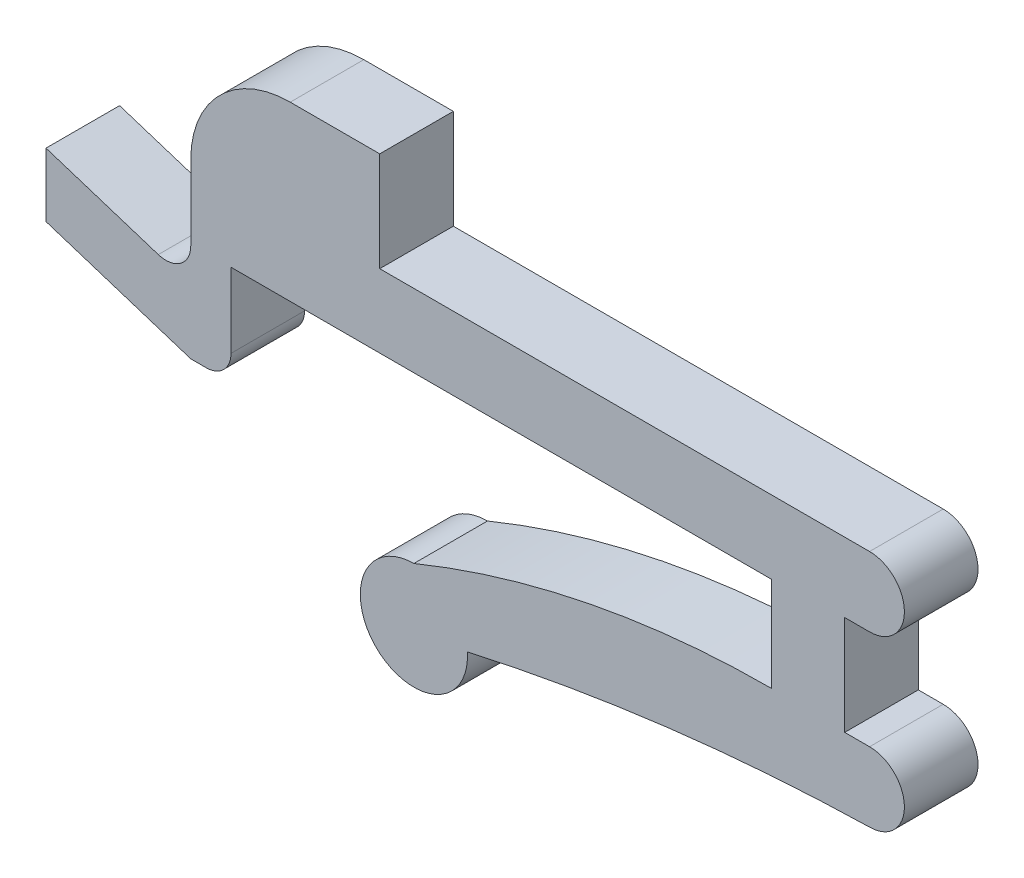
ISO-10303-21;
HEADER;
FILE_DESCRIPTION(('STEP AP214'),'2;1');
FILE_NAME('part.step','',(''),(''),'','','');
FILE_SCHEMA(('AUTOMOTIVE_DESIGN { 1 0 10303 214 1 1 1 1 }'));
ENDSEC;
DATA;
#1=APPLICATION_CONTEXT('core data for automotive mechanical design processes');
#2=APPLICATION_PROTOCOL_DEFINITION('international standard','automotive_design',2000,#1);
#3=PRODUCT_CONTEXT('',#1,'mechanical');
#4=PRODUCT('Part','Part','',(#3));
#5=PRODUCT_RELATED_PRODUCT_CATEGORY('part','',(#4));
#6=PRODUCT_DEFINITION_FORMATION('','',#4);
#7=PRODUCT_DEFINITION_CONTEXT('part definition',#1,'design');
#8=PRODUCT_DEFINITION('design','',#6,#7);
#9=PRODUCT_DEFINITION_SHAPE('','',#8);
#10=(LENGTH_UNIT() NAMED_UNIT(*) SI_UNIT(.MILLI.,.METRE.));
#11=(NAMED_UNIT(*) PLANE_ANGLE_UNIT() SI_UNIT($,.RADIAN.));
#12=(NAMED_UNIT(*) SI_UNIT($,.STERADIAN.) SOLID_ANGLE_UNIT());
#13=UNCERTAINTY_MEASURE_WITH_UNIT(LENGTH_MEASURE(1.E-05),#10,'distance_accuracy_value','');
#14=(GEOMETRIC_REPRESENTATION_CONTEXT(3) GLOBAL_UNCERTAINTY_ASSIGNED_CONTEXT((#13)) GLOBAL_UNIT_ASSIGNED_CONTEXT((#10,
#11,#12)) REPRESENTATION_CONTEXT('',''));
#15=CARTESIAN_POINT('',(0.,0.,0.));
#16=DIRECTION('',(0.,0.,1.));
#17=DIRECTION('',(1.,0.,0.));
#18=AXIS2_PLACEMENT_3D('',#15,#16,#17);
#19=CARTESIAN_POINT('',(62.8560596556779,59.3978768066607,19.7358));
#20=DIRECTION('',(-1.,0.,0.));
#21=DIRECTION('',(0.,0.,1.));
#22=AXIS2_PLACEMENT_3D('',#19,#20,#21);
#23=PLANE('',#22);
#24=DIRECTION('',(0.,1.,0.));
#25=VECTOR('',#24,1.);
#26=CARTESIAN_POINT('',(62.8560596556779,59.3978768066607,17.8562));
#27=LINE('',#26,#25);
#28=CARTESIAN_POINT('',(62.8560596556779,59.3978768066607,17.8562));
#29=VERTEX_POINT('',#28);
#30=CARTESIAN_POINT('',(62.8560596556779,61.9378768066607,17.8562));
#31=VERTEX_POINT('',#30);
#32=EDGE_CURVE('E206',#29,#31,#27,.T.);
#33=ORIENTED_EDGE('',*,*,#32,.T.);
#34=DIRECTION('',(0.,0.,-1.));
#35=VECTOR('',#34,1.);
#36=CARTESIAN_POINT('',(62.8560596556779,61.9378768066607,19.7358));
#37=LINE('',#36,#35);
#38=CARTESIAN_POINT('',(62.8560596556779,61.9378768066607,19.7358));
#39=VERTEX_POINT('',#38);
#40=EDGE_CURVE('E188',#39,#31,#37,.T.);
#41=ORIENTED_EDGE('',*,*,#40,.F.);
#42=DIRECTION('',(0.,1.,0.));
#43=VECTOR('',#42,1.);
#44=CARTESIAN_POINT('',(62.8560596556779,59.3978768066607,19.7358));
#45=LINE('',#44,#43);
#46=CARTESIAN_POINT('',(62.8560596556779,59.3978768066607,19.7358));
#47=VERTEX_POINT('',#46);
#48=EDGE_CURVE('E195',#47,#39,#45,.T.);
#49=ORIENTED_EDGE('',*,*,#48,.F.);
#50=DIRECTION('',(0.,0.,-1.));
#51=VECTOR('',#50,1.);
#52=CARTESIAN_POINT('',(62.8560596556779,59.3978768066607,19.7358));
#53=LINE('',#52,#51);
#54=EDGE_CURVE('E291',#47,#29,#53,.T.);
#55=ORIENTED_EDGE('',*,*,#54,.T.);
#56=EDGE_LOOP('',(#33,#41,#49,#55));
#57=FACE_BOUND('',#56,.T.);
#58=ADVANCED_FACE('F34',(#57),#23,.F.);
#59=CARTESIAN_POINT('',(62.8560596556779,61.9378768066607,19.7358));
#60=DIRECTION('',(0.,-1.,0.));
#61=DIRECTION('',(0.,0.,-1.));
#62=AXIS2_PLACEMENT_3D('',#59,#60,#61);
#63=PLANE('',#62);
#64=DIRECTION('',(-1.,0.,0.));
#65=VECTOR('',#64,1.);
#66=CARTESIAN_POINT('',(62.8560596556779,61.9378768066607,17.8562));
#67=LINE('',#66,#65);
#68=CARTESIAN_POINT('',(60.5700596556779,61.9378768066607,17.8562));
#69=VERTEX_POINT('',#68);
#70=EDGE_CURVE('E251',#31,#69,#67,.T.);
#71=ORIENTED_EDGE('',*,*,#70,.T.);
#72=DIRECTION('',(0.,0.,-1.));
#73=VECTOR('',#72,1.);
#74=CARTESIAN_POINT('',(60.5700596556779,61.9378768066607,19.7358));
#75=LINE('',#74,#73);
#76=CARTESIAN_POINT('',(60.5700596556779,61.9378768066607,19.7358));
#77=VERTEX_POINT('',#76);
#78=EDGE_CURVE('E191',#69,#77,#75,.F.);
#79=ORIENTED_EDGE('',*,*,#78,.T.);
#80=DIRECTION('',(-1.,0.,0.));
#81=VECTOR('',#80,1.);
#82=CARTESIAN_POINT('',(62.8560596556779,61.9378768066607,19.7358));
#83=LINE('',#82,#81);
#84=EDGE_CURVE('E183',#39,#77,#83,.T.);
#85=ORIENTED_EDGE('',*,*,#84,.F.);
#86=ORIENTED_EDGE('',*,*,#40,.T.);
#87=EDGE_LOOP('',(#71,#79,#85,#86));
#88=FACE_BOUND('',#87,.T.);
#89=ADVANCED_FACE('F186',(#88),#63,.F.);
#90=CARTESIAN_POINT('',(58.0300596556779,60.9219383389659,19.7358));
#91=DIRECTION('',(1.,0.,0.));
#92=DIRECTION('',(0.,1.,0.));
#93=AXIS2_PLACEMENT_3D('',#90,#91,#92);
#94=PLANE('',#93);
#95=DIRECTION('',(0.,-1.,0.));
#96=VECTOR('',#95,1.);
#97=CARTESIAN_POINT('',(58.0300596556779,60.9219383389659,17.8562));
#98=LINE('',#97,#96);
#99=CARTESIAN_POINT('',(58.0300596556779,59.3978768066607,17.8562));
#100=VERTEX_POINT('',#99);
#101=CARTESIAN_POINT('',(58.0300596556779,57.48726548621,17.8562));
#102=VERTEX_POINT('',#101);
#103=EDGE_CURVE('E247',#100,#102,#98,.T.);
#104=ORIENTED_EDGE('',*,*,#103,.T.);
#105=DIRECTION('',(0.,0.,-1.));
#106=VECTOR('',#105,1.);
#107=CARTESIAN_POINT('',(58.0300596556779,57.48726548621,19.7358));
#108=LINE('',#107,#106);
#109=CARTESIAN_POINT('',(58.0300596556779,57.48726548621,19.7358));
#110=VERTEX_POINT('',#109);
#111=EDGE_CURVE('E55',#102,#110,#108,.F.);
#112=ORIENTED_EDGE('',*,*,#111,.T.);
#113=DIRECTION('',(0.,-1.,0.));
#114=VECTOR('',#113,1.);
#115=CARTESIAN_POINT('',(58.0300596556779,61.9378768066607,19.7358));
#116=LINE('',#115,#114);
#117=CARTESIAN_POINT('',(58.0300596556779,59.3978768066607,19.7358));
#118=VERTEX_POINT('',#117);
#119=EDGE_CURVE('E194',#118,#110,#116,.T.);
#120=ORIENTED_EDGE('',*,*,#119,.F.);
#121=DIRECTION('',(0.,0.,-1.));
#122=VECTOR('',#121,1.);
#123=CARTESIAN_POINT('',(58.0300596556779,59.3978768066607,19.7358));
#124=LINE('',#123,#122);
#125=EDGE_CURVE('E223',#118,#100,#124,.T.);
#126=ORIENTED_EDGE('',*,*,#125,.T.);
#127=EDGE_LOOP('',(#104,#112,#120,#126));
#128=FACE_BOUND('',#127,.T.);
#129=ADVANCED_FACE('F374',(#128),#94,.F.);
#130=CARTESIAN_POINT('',(58.0300596556779,56.6165768066607,19.7358));
#131=DIRECTION('',(-0.30557694918218,-0.952167384512047,0.));
#132=DIRECTION('',(0.952167384512047,-0.30557694918218,0.));
#133=AXIS2_PLACEMENT_3D('',#130,#131,#132);
#134=PLANE('',#133);
#135=DIRECTION('',(-0.952167384512047,0.30557694918218,0.));
#136=VECTOR('',#135,1.);
#137=CARTESIAN_POINT('',(58.0300596556779,56.6165768066607,19.7358));
#138=LINE('',#137,#136);
#139=CARTESIAN_POINT('',(57.2010182929472,56.8826391970449,19.7358));
#140=VERTEX_POINT('',#139);
#141=CARTESIAN_POINT('',(54.3331990812724,57.8030020027492,19.7358));
#142=VERTEX_POINT('',#141);
#143=EDGE_CURVE('E240',#140,#142,#138,.T.);
#144=ORIENTED_EDGE('',*,*,#143,.F.);
#145=DIRECTION('',(0.,0.,-1.));
#146=VECTOR('',#145,1.);
#147=CARTESIAN_POINT('',(57.2010182929472,56.8826391970449,17.8562));
#148=LINE('',#147,#146);
#149=CARTESIAN_POINT('',(57.2010182929472,56.8826391970449,17.8562));
#150=VERTEX_POINT('',#149);
#151=EDGE_CURVE('E231',#140,#150,#148,.T.);
#152=ORIENTED_EDGE('',*,*,#151,.T.);
#153=DIRECTION('',(-0.952167384512047,0.30557694918218,0.));
#154=VECTOR('',#153,1.);
#155=CARTESIAN_POINT('',(58.0300596556779,56.6165768066607,17.8562));
#156=LINE('',#155,#154);
#157=CARTESIAN_POINT('',(54.3331990812724,57.8030020027492,17.8562));
#158=VERTEX_POINT('',#157);
#159=EDGE_CURVE('E239',#150,#158,#156,.T.);
#160=ORIENTED_EDGE('',*,*,#159,.T.);
#161=DIRECTION('',(0.,0.,-1.));
#162=VECTOR('',#161,1.);
#163=CARTESIAN_POINT('',(54.3331990812724,57.8030020027492,19.7358));
#164=LINE('',#163,#162);
#165=EDGE_CURVE('E208',#142,#158,#164,.T.);
#166=ORIENTED_EDGE('',*,*,#165,.F.);
#167=EDGE_LOOP('',(#144,#152,#160,#166));
#168=FACE_BOUND('',#167,.T.);
#169=ADVANCED_FACE('F237',(#168),#134,.F.);
#170=CARTESIAN_POINT('',(54.3331990812724,57.8030020027492,19.7358));
#171=DIRECTION('',(1.,0.,0.));
#172=DIRECTION('',(0.,0.,-1.));
#173=AXIS2_PLACEMENT_3D('',#170,#171,#172);
#174=PLANE('',#173);
#175=DIRECTION('',(0.,-1.,0.));
#176=VECTOR('',#175,1.);
#177=CARTESIAN_POINT('',(54.3331990812724,57.8030020027492,17.8562));
#178=LINE('',#177,#176);
#179=CARTESIAN_POINT('',(54.3331990812724,56.1774020027492,17.8562));
#180=VERTEX_POINT('',#179);
#181=EDGE_CURVE('E246',#158,#180,#178,.T.);
#182=ORIENTED_EDGE('',*,*,#181,.T.);
#183=DIRECTION('',(0.,0.,-1.));
#184=VECTOR('',#183,1.);
#185=CARTESIAN_POINT('',(54.3331990812724,56.1774020027492,19.7358));
#186=LINE('',#185,#184);
#187=CARTESIAN_POINT('',(54.3331990812724,56.1774020027492,19.7358));
#188=VERTEX_POINT('',#187);
#189=EDGE_CURVE('E214',#188,#180,#186,.T.);
#190=ORIENTED_EDGE('',*,*,#189,.F.);
#191=DIRECTION('',(0.,-1.,0.));
#192=VECTOR('',#191,1.);
#193=CARTESIAN_POINT('',(54.3331990812724,57.8030020027492,19.7358));
#194=LINE('',#193,#192);
#195=EDGE_CURVE('E339',#142,#188,#194,.T.);
#196=ORIENTED_EDGE('',*,*,#195,.F.);
#197=ORIENTED_EDGE('',*,*,#165,.T.);
#198=EDGE_LOOP('',(#182,#190,#196,#197));
#199=FACE_BOUND('',#198,.T.);
#200=ADVANCED_FACE('F376',(#199),#174,.F.);
#201=CARTESIAN_POINT('',(54.3331990812724,56.1774020027492,19.7358));
#202=DIRECTION('',(0.30557694918218,0.952167384512046,0.));
#203=DIRECTION('',(-0.952167384512046,0.30557694918218,0.));
#204=AXIS2_PLACEMENT_3D('',#201,#202,#203);
#205=PLANE('',#204);
#206=DIRECTION('',(0.952167384512046,-0.30557694918218,0.));
#207=VECTOR('',#206,1.);
#208=CARTESIAN_POINT('',(54.3331990812724,56.1774020027492,17.8562));
#209=LINE('',#208,#207);
#210=CARTESIAN_POINT('',(58.0300596556779,54.9909768066607,17.8562));
#211=VERTEX_POINT('',#210);
#212=EDGE_CURVE('E249',#180,#211,#209,.T.);
#213=ORIENTED_EDGE('',*,*,#212,.T.);
#214=DIRECTION('',(0.,0.,-1.));
#215=VECTOR('',#214,1.);
#216=CARTESIAN_POINT('',(58.0300596556779,54.9909768066607,19.7358));
#217=LINE('',#216,#215);
#218=CARTESIAN_POINT('',(58.0300596556779,54.9909768066607,19.7358));
#219=VERTEX_POINT('',#218);
#220=EDGE_CURVE('E318',#219,#211,#217,.T.);
#221=ORIENTED_EDGE('',*,*,#220,.F.);
#222=DIRECTION('',(0.952167384512046,-0.30557694918218,0.));
#223=VECTOR('',#222,1.);
#224=CARTESIAN_POINT('',(54.3331990812724,56.1774020027492,19.7358));
#225=LINE('',#224,#223);
#226=EDGE_CURVE('E327',#188,#219,#225,.T.);
#227=ORIENTED_EDGE('',*,*,#226,.F.);
#228=ORIENTED_EDGE('',*,*,#189,.T.);
#229=EDGE_LOOP('',(#213,#221,#227,#228));
#230=FACE_BOUND('',#229,.T.);
#231=ADVANCED_FACE('F324',(#230),#205,.F.);
#232=CARTESIAN_POINT('',(59.0576400176009,54.9909768066607,19.7358));
#233=DIRECTION('',(0.,-1.,0.));
#234=DIRECTION('',(1.,0.,0.));
#235=AXIS2_PLACEMENT_3D('',#232,#233,#234);
#236=PLANE('',#235);
#237=DIRECTION('',(-1.,0.,0.));
#238=VECTOR('',#237,1.);
#239=CARTESIAN_POINT('',(59.0576400176009,54.9909768066607,17.8562));
#240=LINE('',#239,#238);
#241=CARTESIAN_POINT('',(58.4226400176009,54.9909768066607,17.8562));
#242=VERTEX_POINT('',#241);
#243=EDGE_CURVE('E257',#242,#211,#240,.T.);
#244=ORIENTED_EDGE('',*,*,#243,.F.);
#245=DIRECTION('',(0.,0.,-1.));
#246=VECTOR('',#245,1.);
#247=CARTESIAN_POINT('',(58.4226400176009,54.9909768066607,19.7358));
#248=LINE('',#247,#246);
#249=CARTESIAN_POINT('',(58.4226400176009,54.9909768066607,19.7358));
#250=VERTEX_POINT('',#249);
#251=EDGE_CURVE('E219',#242,#250,#248,.F.);
#252=ORIENTED_EDGE('',*,*,#251,.T.);
#253=DIRECTION('',(-1.,0.,0.));
#254=VECTOR('',#253,1.);
#255=CARTESIAN_POINT('',(59.0576400176009,54.9909768066607,19.7358));
#256=LINE('',#255,#254);
#257=EDGE_CURVE('E335',#250,#219,#256,.T.);
#258=ORIENTED_EDGE('',*,*,#257,.T.);
#259=ORIENTED_EDGE('',*,*,#220,.T.);
#260=EDGE_LOOP('',(#244,#252,#258,#259));
#261=FACE_BOUND('',#260,.T.);
#262=ADVANCED_FACE('F333',(#261),#236,.T.);
#263=CARTESIAN_POINT('',(59.0576400176009,57.5309768066607,19.7358));
#264=DIRECTION('',(1.,0.,0.));
#265=DIRECTION('',(0.,0.,-1.));
#266=AXIS2_PLACEMENT_3D('',#263,#264,#265);
#267=PLANE('',#266);
#268=DIRECTION('',(0.,-1.,0.));
#269=VECTOR('',#268,1.);
#270=CARTESIAN_POINT('',(59.0576400176009,57.5309768066607,19.7358));
#271=LINE('',#270,#269);
#272=CARTESIAN_POINT('',(59.0576400176009,57.5309768066607,19.7358));
#273=VERTEX_POINT('',#272);
#274=CARTESIAN_POINT('',(59.0576400176009,55.6259768066608,19.7358));
#275=VERTEX_POINT('',#274);
#276=EDGE_CURVE('E337',#273,#275,#271,.T.);
#277=ORIENTED_EDGE('',*,*,#276,.T.);
#278=DIRECTION('',(0.,0.,-1.));
#279=VECTOR('',#278,1.);
#280=CARTESIAN_POINT('',(59.0576400176009,55.6259768066608,19.7358));
#281=LINE('',#280,#279);
#282=CARTESIAN_POINT('',(59.0576400176009,55.6259768066608,17.8562));
#283=VERTEX_POINT('',#282);
#284=EDGE_CURVE('E207',#275,#283,#281,.T.);
#285=ORIENTED_EDGE('',*,*,#284,.T.);
#286=DIRECTION('',(0.,-1.,0.));
#287=VECTOR('',#286,1.);
#288=CARTESIAN_POINT('',(59.0576400176009,57.5309768066607,17.8562));
#289=LINE('',#288,#287);
#290=CARTESIAN_POINT('',(59.0576400176009,57.5309768066607,17.8562));
#291=VERTEX_POINT('',#290);
#292=EDGE_CURVE('E259',#291,#283,#289,.T.);
#293=ORIENTED_EDGE('',*,*,#292,.F.);
#294=DIRECTION('',(0.,0.,-1.));
#295=VECTOR('',#294,1.);
#296=CARTESIAN_POINT('',(59.0576400176009,57.5309768066607,19.7358));
#297=LINE('',#296,#295);
#298=EDGE_CURVE('E316',#273,#291,#297,.T.);
#299=ORIENTED_EDGE('',*,*,#298,.F.);
#300=EDGE_LOOP('',(#277,#285,#293,#299));
#301=FACE_BOUND('',#300,.T.);
#302=ADVANCED_FACE('F443',(#301),#267,.T.);
#303=CARTESIAN_POINT('',(59.0576400176009,57.5309768066607,19.7358));
#304=DIRECTION('',(0.,1.,0.));
#305=DIRECTION('',(0.,0.,1.));
#306=AXIS2_PLACEMENT_3D('',#303,#304,#305);
#307=PLANE('',#306);
#308=DIRECTION('',(1.,0.,0.));
#309=VECTOR('',#308,1.);
#310=CARTESIAN_POINT('',(59.0576400176009,57.5309768066607,17.8562));
#311=LINE('',#310,#309);
#312=CARTESIAN_POINT('',(72.8636596556779,57.5309768066607,17.8562));
#313=VERTEX_POINT('',#312);
#314=EDGE_CURVE('E262',#291,#313,#311,.T.);
#315=ORIENTED_EDGE('',*,*,#314,.T.);
#316=DIRECTION('',(0.,0.,-1.));
#317=VECTOR('',#316,1.);
#318=CARTESIAN_POINT('',(72.8636596556779,57.5309768066607,19.7358));
#319=LINE('',#318,#317);
#320=CARTESIAN_POINT('',(72.8636596556779,57.5309768066607,19.7358));
#321=VERTEX_POINT('',#320);
#322=EDGE_CURVE('E313',#321,#313,#319,.T.);
#323=ORIENTED_EDGE('',*,*,#322,.F.);
#324=DIRECTION('',(1.,0.,0.));
#325=VECTOR('',#324,1.);
#326=CARTESIAN_POINT('',(59.0576400176009,57.5309768066607,19.7358));
#327=LINE('',#326,#325);
#328=EDGE_CURVE('E346',#273,#321,#327,.T.);
#329=ORIENTED_EDGE('',*,*,#328,.F.);
#330=ORIENTED_EDGE('',*,*,#298,.T.);
#331=EDGE_LOOP('',(#315,#323,#329,#330));
#332=FACE_BOUND('',#331,.T.);
#333=ADVANCED_FACE('F449',(#332),#307,.F.);
#334=CARTESIAN_POINT('',(72.8636596556779,57.5309768066607,19.7358));
#335=DIRECTION('',(1.,0.,0.));
#336=DIRECTION('',(0.,1.,0.));
#337=AXIS2_PLACEMENT_3D('',#334,#335,#336);
#338=PLANE('',#337);
#339=DIRECTION('',(0.,-1.,0.));
#340=VECTOR('',#339,1.);
#341=CARTESIAN_POINT('',(72.8636596556779,57.5309768066607,17.8562));
#342=LINE('',#341,#340);
#343=CARTESIAN_POINT('',(72.8636596556779,55.1179768066607,17.8562));
#344=VERTEX_POINT('',#343);
#345=EDGE_CURVE('E264',#313,#344,#342,.T.);
#346=ORIENTED_EDGE('',*,*,#345,.T.);
#347=DIRECTION('',(0.,0.,-1.));
#348=VECTOR('',#347,1.);
#349=CARTESIAN_POINT('',(72.8636596556779,55.1179768066607,19.7358));
#350=LINE('',#349,#348);
#351=CARTESIAN_POINT('',(72.8636596556779,55.1179768066607,19.7358));
#352=VERTEX_POINT('',#351);
#353=EDGE_CURVE('E310',#352,#344,#350,.T.);
#354=ORIENTED_EDGE('',*,*,#353,.F.);
#355=DIRECTION('',(0.,-1.,0.));
#356=VECTOR('',#355,1.);
#357=CARTESIAN_POINT('',(72.8636596556779,57.5309768066607,19.7358));
#358=LINE('',#357,#356);
#359=EDGE_CURVE('E348',#321,#352,#358,.T.);
#360=ORIENTED_EDGE('',*,*,#359,.F.);
#361=ORIENTED_EDGE('',*,*,#322,.T.);
#362=EDGE_LOOP('',(#346,#354,#360,#361));
#363=FACE_BOUND('',#362,.T.);
#364=ADVANCED_FACE('F548',(#363),#338,.F.);
#365=CARTESIAN_POINT('',(72.8636596556779,31.0809044744012,19.7358));
#366=DIRECTION('',(0.,0.,-1.));
#367=DIRECTION('',(-1.,0.,0.));
#368=AXIS2_PLACEMENT_3D('',#365,#366,#367);
#369=CYLINDRICAL_SURFACE('',#368,24.0370723322595);
#370=CARTESIAN_POINT('',(72.8636596556779,31.0809044744012,17.8562));
#371=DIRECTION('',(0.,0.,1.));
#372=DIRECTION('',(1.,0.,0.));
#373=AXIS2_PLACEMENT_3D('',#370,#371,#372);
#374=CIRCLE('',#373,24.0370723322595);
#375=CARTESIAN_POINT('',(63.7281562790385,53.3142898298006,17.8562));
#376=VERTEX_POINT('',#375);
#377=EDGE_CURVE('E266',#344,#376,#374,.T.);
#378=ORIENTED_EDGE('',*,*,#377,.T.);
#379=DIRECTION('',(0.,0.,-1.));
#380=VECTOR('',#379,1.);
#381=CARTESIAN_POINT('',(63.7281562790385,53.3142898298006,19.7358));
#382=LINE('',#381,#380);
#383=CARTESIAN_POINT('',(63.7281562790385,53.3142898298006,19.7358));
#384=VERTEX_POINT('',#383);
#385=EDGE_CURVE('E307',#384,#376,#382,.T.);
#386=ORIENTED_EDGE('',*,*,#385,.F.);
#387=CARTESIAN_POINT('',(72.8636596556779,31.0809044744012,19.7358));
#388=DIRECTION('',(0.,0.,1.));
#389=DIRECTION('',(1.,0.,0.));
#390=AXIS2_PLACEMENT_3D('',#387,#388,#389);
#391=CIRCLE('',#390,24.0370723322595);
#392=EDGE_CURVE('E350',#352,#384,#391,.T.);
#393=ORIENTED_EDGE('',*,*,#392,.F.);
#394=ORIENTED_EDGE('',*,*,#353,.T.);
#395=EDGE_LOOP('',(#378,#386,#393,#394));
#396=FACE_BOUND('',#395,.T.);
#397=ADVANCED_FACE('F538',(#396),#369,.T.);
#398=CARTESIAN_POINT('',(63.7281562790385,51.9458788360038,19.7358));
#399=DIRECTION('',(0.,0.,-1.));
#400=DIRECTION('',(-1.,0.,0.));
#401=AXIS2_PLACEMENT_3D('',#398,#399,#400);
#402=CYLINDRICAL_SURFACE('',#401,1.3684109937968);
#403=CARTESIAN_POINT('',(63.7281562790385,51.9458788360038,17.8562));
#404=DIRECTION('',(0.,0.,1.));
#405=DIRECTION('',(1.,0.,0.));
#406=AXIS2_PLACEMENT_3D('',#403,#404,#405);
#407=CIRCLE('',#406,1.3684109937968);
#408=CARTESIAN_POINT('',(65.0932711698663,52.0407997651199,17.8562));
#409=VERTEX_POINT('',#408);
#410=EDGE_CURVE('E268',#376,#409,#407,.T.);
#411=ORIENTED_EDGE('',*,*,#410,.T.);
#412=DIRECTION('',(0.,0.,-1.));
#413=VECTOR('',#412,1.);
#414=CARTESIAN_POINT('',(65.0932711698663,52.0407997651199,19.7358));
#415=LINE('',#414,#413);
#416=CARTESIAN_POINT('',(65.0932711698663,52.0407997651199,19.7358));
#417=VERTEX_POINT('',#416);
#418=EDGE_CURVE('E305',#417,#409,#415,.T.);
#419=ORIENTED_EDGE('',*,*,#418,.F.);
#420=CARTESIAN_POINT('',(63.7281562790385,51.9458788360038,19.7358));
#421=DIRECTION('',(0.,0.,1.));
#422=DIRECTION('',(1.,0.,0.));
#423=AXIS2_PLACEMENT_3D('',#420,#421,#422);
#424=CIRCLE('',#423,1.3684109937968);
#425=EDGE_CURVE('E352',#384,#417,#424,.T.);
#426=ORIENTED_EDGE('',*,*,#425,.F.);
#427=ORIENTED_EDGE('',*,*,#385,.T.);
#428=EDGE_LOOP('',(#411,#419,#426,#427));
#429=FACE_BOUND('',#428,.T.);
#430=ADVANCED_FACE('F528',(#429),#402,.T.);
#431=CARTESIAN_POINT('',(76.5851415420103,0.899836477741234,19.7358));
#432=DIRECTION('',(0.,0.,-1.));
#433=DIRECTION('',(-1.,0.,0.));
#434=AXIS2_PLACEMENT_3D('',#431,#432,#433);
#435=CYLINDRICAL_SURFACE('',#434,52.4162304120697);
#436=CARTESIAN_POINT('',(76.5851415420103,0.899836477741234,17.8562));
#437=DIRECTION('',(0.,0.,1.));
#438=DIRECTION('',(1.,0.,0.));
#439=AXIS2_PLACEMENT_3D('',#436,#437,#438);
#440=CIRCLE('',#439,52.4162304120697);
#441=CARTESIAN_POINT('',(75.3655596556779,53.3018768066607,17.8562));
#442=VERTEX_POINT('',#441);
#443=EDGE_CURVE('E271',#442,#409,#440,.T.);
#444=ORIENTED_EDGE('',*,*,#443,.F.);
#445=DIRECTION('',(0.,0.,-1.));
#446=VECTOR('',#445,1.);
#447=CARTESIAN_POINT('',(75.3655596556779,53.3018768066607,19.7358));
#448=LINE('',#447,#446);
#449=CARTESIAN_POINT('',(75.3655596556779,53.3018768066607,19.7358));
#450=VERTEX_POINT('',#449);
#451=EDGE_CURVE('E303',#450,#442,#448,.T.);
#452=ORIENTED_EDGE('',*,*,#451,.F.);
#453=CARTESIAN_POINT('',(76.5851415420103,0.899836477741234,19.7358));
#454=DIRECTION('',(0.,0.,1.));
#455=DIRECTION('',(1.,0.,0.));
#456=AXIS2_PLACEMENT_3D('',#453,#454,#455);
#457=CIRCLE('',#456,52.4162304120697);
#458=EDGE_CURVE('E354',#450,#417,#457,.T.);
#459=ORIENTED_EDGE('',*,*,#458,.T.);
#460=ORIENTED_EDGE('',*,*,#418,.T.);
#461=EDGE_LOOP('',(#444,#452,#459,#460));
#462=FACE_BOUND('',#461,.T.);
#463=ADVANCED_FACE('F518',(#462),#435,.F.);
#464=CARTESIAN_POINT('',(75.3655596556779,54.1908768066608,19.7358));
#465=DIRECTION('',(0.,0.,-1.));
#466=DIRECTION('',(-1.,0.,0.));
#467=AXIS2_PLACEMENT_3D('',#464,#465,#466);
#468=CYLINDRICAL_SURFACE('',#467,0.889);
#469=CARTESIAN_POINT('',(75.3655596556779,54.1908768066608,17.8562));
#470=DIRECTION('',(0.,0.,1.));
#471=DIRECTION('',(1.,0.,0.));
#472=AXIS2_PLACEMENT_3D('',#469,#470,#471);
#473=CIRCLE('',#472,0.889);
#474=CARTESIAN_POINT('',(75.3655596556779,55.0798768066607,17.8562));
#475=VERTEX_POINT('',#474);
#476=EDGE_CURVE('E274',#442,#475,#473,.T.);
#477=ORIENTED_EDGE('',*,*,#476,.T.);
#478=DIRECTION('',(0.,0.,-1.));
#479=VECTOR('',#478,1.);
#480=CARTESIAN_POINT('',(75.3655596556779,55.0798768066607,19.7358));
#481=LINE('',#480,#479);
#482=CARTESIAN_POINT('',(75.3655596556779,55.0798768066607,19.7358));
#483=VERTEX_POINT('',#482);
#484=EDGE_CURVE('E301',#483,#475,#481,.T.);
#485=ORIENTED_EDGE('',*,*,#484,.F.);
#486=CARTESIAN_POINT('',(75.3655596556779,54.1908768066608,19.7358));
#487=DIRECTION('',(0.,0.,1.));
#488=DIRECTION('',(1.,0.,0.));
#489=AXIS2_PLACEMENT_3D('',#486,#487,#488);
#490=CIRCLE('',#489,0.889);
#491=EDGE_CURVE('E357',#450,#483,#490,.T.);
#492=ORIENTED_EDGE('',*,*,#491,.F.);
#493=ORIENTED_EDGE('',*,*,#451,.T.);
#494=EDGE_LOOP('',(#477,#485,#492,#493));
#495=FACE_BOUND('',#494,.T.);
#496=ADVANCED_FACE('F508',(#495),#468,.T.);
#497=CARTESIAN_POINT('',(74.7305596556779,55.0798768066607,19.7358));
#498=DIRECTION('',(0.,1.,0.));
#499=DIRECTION('',(0.,0.,1.));
#500=AXIS2_PLACEMENT_3D('',#497,#498,#499);
#501=PLANE('',#500);
#502=DIRECTION('',(1.,0.,0.));
#503=VECTOR('',#502,1.);
#504=CARTESIAN_POINT('',(74.7305596556779,55.0798768066607,17.8562));
#505=LINE('',#504,#503);
#506=CARTESIAN_POINT('',(74.7305596556779,55.0798768066607,17.8562));
#507=VERTEX_POINT('',#506);
#508=EDGE_CURVE('E277',#507,#475,#505,.T.);
#509=ORIENTED_EDGE('',*,*,#508,.F.);
#510=DIRECTION('',(0.,0.,-1.));
#511=VECTOR('',#510,1.);
#512=CARTESIAN_POINT('',(74.7305596556779,55.0798768066607,19.7358));
#513=LINE('',#512,#511);
#514=CARTESIAN_POINT('',(74.7305596556779,55.0798768066607,19.7358));
#515=VERTEX_POINT('',#514);
#516=EDGE_CURVE('E299',#515,#507,#513,.T.);
#517=ORIENTED_EDGE('',*,*,#516,.F.);
#518=DIRECTION('',(1.,0.,0.));
#519=VECTOR('',#518,1.);
#520=CARTESIAN_POINT('',(74.7305596556779,55.0798768066607,19.7358));
#521=LINE('',#520,#519);
#522=EDGE_CURVE('E359',#515,#483,#521,.T.);
#523=ORIENTED_EDGE('',*,*,#522,.T.);
#524=ORIENTED_EDGE('',*,*,#484,.T.);
#525=EDGE_LOOP('',(#509,#517,#523,#524));
#526=FACE_BOUND('',#525,.T.);
#527=ADVANCED_FACE('F498',(#526),#501,.T.);
#528=CARTESIAN_POINT('',(74.7305596556779,57.6198768066607,19.7358));
#529=DIRECTION('',(1.,0.,0.));
#530=DIRECTION('',(0.,0.,-1.));
#531=AXIS2_PLACEMENT_3D('',#528,#529,#530);
#532=PLANE('',#531);
#533=DIRECTION('',(0.,-1.,0.));
#534=VECTOR('',#533,1.);
#535=CARTESIAN_POINT('',(74.7305596556779,57.6198768066607,17.8562));
#536=LINE('',#535,#534);
#537=CARTESIAN_POINT('',(74.7305596556779,57.6198768066607,17.8562));
#538=VERTEX_POINT('',#537);
#539=EDGE_CURVE('E280',#538,#507,#536,.T.);
#540=ORIENTED_EDGE('',*,*,#539,.F.);
#541=DIRECTION('',(0.,0.,-1.));
#542=VECTOR('',#541,1.);
#543=CARTESIAN_POINT('',(74.7305596556779,57.6198768066607,19.7358));
#544=LINE('',#543,#542);
#545=CARTESIAN_POINT('',(74.7305596556779,57.6198768066607,19.7358));
#546=VERTEX_POINT('',#545);
#547=EDGE_CURVE('E297',#546,#538,#544,.T.);
#548=ORIENTED_EDGE('',*,*,#547,.F.);
#549=DIRECTION('',(0.,-1.,0.));
#550=VECTOR('',#549,1.);
#551=CARTESIAN_POINT('',(74.7305596556779,57.6198768066607,19.7358));
#552=LINE('',#551,#550);
#553=EDGE_CURVE('E362',#546,#515,#552,.T.);
#554=ORIENTED_EDGE('',*,*,#553,.T.);
#555=ORIENTED_EDGE('',*,*,#516,.T.);
#556=EDGE_LOOP('',(#540,#548,#554,#555));
#557=FACE_BOUND('',#556,.T.);
#558=ADVANCED_FACE('F488',(#557),#532,.T.);
#559=CARTESIAN_POINT('',(75.3655596556779,57.6198768066607,19.7358));
#560=DIRECTION('',(0.,-1.,0.));
#561=DIRECTION('',(0.,0.,-1.));
#562=AXIS2_PLACEMENT_3D('',#559,#560,#561);
#563=PLANE('',#562);
#564=DIRECTION('',(-1.,0.,0.));
#565=VECTOR('',#564,1.);
#566=CARTESIAN_POINT('',(75.3655596556779,57.6198768066607,17.8562));
#567=LINE('',#566,#565);
#568=CARTESIAN_POINT('',(75.3655596556779,57.6198768066607,17.8562));
#569=VERTEX_POINT('',#568);
#570=EDGE_CURVE('E283',#569,#538,#567,.T.);
#571=ORIENTED_EDGE('',*,*,#570,.F.);
#572=DIRECTION('',(0.,0.,-1.));
#573=VECTOR('',#572,1.);
#574=CARTESIAN_POINT('',(75.3655596556779,57.6198768066607,19.7358));
#575=LINE('',#574,#573);
#576=CARTESIAN_POINT('',(75.3655596556779,57.6198768066607,19.7358));
#577=VERTEX_POINT('',#576);
#578=EDGE_CURVE('E295',#577,#569,#575,.T.);
#579=ORIENTED_EDGE('',*,*,#578,.F.);
#580=DIRECTION('',(-1.,0.,0.));
#581=VECTOR('',#580,1.);
#582=CARTESIAN_POINT('',(75.3655596556779,57.6198768066607,19.7358));
#583=LINE('',#582,#581);
#584=EDGE_CURVE('E365',#577,#546,#583,.T.);
#585=ORIENTED_EDGE('',*,*,#584,.T.);
#586=ORIENTED_EDGE('',*,*,#547,.T.);
#587=EDGE_LOOP('',(#571,#579,#585,#586));
#588=FACE_BOUND('',#587,.T.);
#589=ADVANCED_FACE('F478',(#588),#563,.T.);
#590=CARTESIAN_POINT('',(75.3655596556779,58.5088768066608,19.7358));
#591=DIRECTION('',(0.,0.,-1.));
#592=DIRECTION('',(-1.,0.,0.));
#593=AXIS2_PLACEMENT_3D('',#590,#591,#592);
#594=CYLINDRICAL_SURFACE('',#593,0.889);
#595=CARTESIAN_POINT('',(75.3655596556779,58.5088768066608,17.8562));
#596=DIRECTION('',(0.,0.,1.));
#597=DIRECTION('',(1.,0.,0.));
#598=AXIS2_PLACEMENT_3D('',#595,#596,#597);
#599=CIRCLE('',#598,0.889);
#600=CARTESIAN_POINT('',(75.3655596556779,59.3978768066607,17.8562));
#601=VERTEX_POINT('',#600);
#602=EDGE_CURVE('E286',#569,#601,#599,.T.);
#603=ORIENTED_EDGE('',*,*,#602,.T.);
#604=DIRECTION('',(0.,0.,-1.));
#605=VECTOR('',#604,1.);
#606=CARTESIAN_POINT('',(75.3655596556779,59.3978768066607,19.7358));
#607=LINE('',#606,#605);
#608=CARTESIAN_POINT('',(75.3655596556779,59.3978768066607,19.7358));
#609=VERTEX_POINT('',#608);
#610=EDGE_CURVE('E293',#609,#601,#607,.T.);
#611=ORIENTED_EDGE('',*,*,#610,.F.);
#612=CARTESIAN_POINT('',(75.3655596556779,58.5088768066608,19.7358));
#613=DIRECTION('',(0.,0.,1.));
#614=DIRECTION('',(1.,0.,0.));
#615=AXIS2_PLACEMENT_3D('',#612,#613,#614);
#616=CIRCLE('',#615,0.889);
#617=EDGE_CURVE('E368',#577,#609,#616,.T.);
#618=ORIENTED_EDGE('',*,*,#617,.F.);
#619=ORIENTED_EDGE('',*,*,#578,.T.);
#620=EDGE_LOOP('',(#603,#611,#618,#619));
#621=FACE_BOUND('',#620,.T.);
#622=ADVANCED_FACE('F468',(#621),#594,.T.);
#623=CARTESIAN_POINT('',(62.8560596556779,59.3978768066607,19.7358));
#624=DIRECTION('',(0.,1.,0.));
#625=DIRECTION('',(0.,0.,1.));
#626=AXIS2_PLACEMENT_3D('',#623,#624,#625);
#627=PLANE('',#626);
#628=DIRECTION('',(1.,0.,0.));
#629=VECTOR('',#628,1.);
#630=CARTESIAN_POINT('',(62.8560596556779,59.3978768066607,17.8562));
#631=LINE('',#630,#629);
#632=EDGE_CURVE('E203',#29,#601,#631,.T.);
#633=ORIENTED_EDGE('',*,*,#632,.F.);
#634=ORIENTED_EDGE('',*,*,#54,.F.);
#635=DIRECTION('',(1.,0.,0.));
#636=VECTOR('',#635,1.);
#637=CARTESIAN_POINT('',(62.8560596556779,59.3978768066607,19.7358));
#638=LINE('',#637,#636);
#639=EDGE_CURVE('E201',#47,#609,#638,.T.);
#640=ORIENTED_EDGE('',*,*,#639,.T.);
#641=ORIENTED_EDGE('',*,*,#610,.T.);
#642=EDGE_LOOP('',(#633,#634,#640,#641));
#643=FACE_BOUND('',#642,.T.);
#644=ADVANCED_FACE('F425',(#643),#627,.T.);
#645=CARTESIAN_POINT('',(72.8636596556779,31.0809044744012,19.7358));
#646=DIRECTION('',(0.,0.,1.));
#647=DIRECTION('',(1.,0.,0.));
#648=AXIS2_PLACEMENT_3D('',#645,#646,#647);
#649=PLANE('',#648);
#650=ORIENTED_EDGE('',*,*,#84,.T.);
#651=CARTESIAN_POINT('',(60.5700596556779,59.3978768066607,19.7358));
#652=DIRECTION('',(0.,0.,1.));
#653=DIRECTION('',(1.,0.,0.));
#654=AXIS2_PLACEMENT_3D('',#651,#652,#653);
#655=CIRCLE('',#654,2.54);
#656=EDGE_CURVE('E229',#77,#118,#655,.T.);
#657=ORIENTED_EDGE('',*,*,#656,.T.);
#658=ORIENTED_EDGE('',*,*,#119,.T.);
#659=CARTESIAN_POINT('',(57.3950596556779,57.48726548621,19.7358));
#660=DIRECTION('',(0.,0.,1.));
#661=DIRECTION('',(1.,0.,0.));
#662=AXIS2_PLACEMENT_3D('',#659,#660,#661);
#663=CIRCLE('',#662,0.635);
#664=EDGE_CURVE('E11',#110,#140,#663,.F.);
#665=ORIENTED_EDGE('',*,*,#664,.T.);
#666=ORIENTED_EDGE('',*,*,#143,.T.);
#667=ORIENTED_EDGE('',*,*,#195,.T.);
#668=ORIENTED_EDGE('',*,*,#226,.T.);
#669=ORIENTED_EDGE('',*,*,#257,.F.);
#670=CARTESIAN_POINT('',(58.4226400176009,55.6259768066608,19.7358));
#671=DIRECTION('',(0.,0.,1.));
#672=DIRECTION('',(1.,0.,0.));
#673=AXIS2_PLACEMENT_3D('',#670,#671,#672);
#674=CIRCLE('',#673,0.635);
#675=EDGE_CURVE('E221',#250,#275,#674,.T.);
#676=ORIENTED_EDGE('',*,*,#675,.T.);
#677=ORIENTED_EDGE('',*,*,#276,.F.);
#678=ORIENTED_EDGE('',*,*,#328,.T.);
#679=ORIENTED_EDGE('',*,*,#359,.T.);
#680=ORIENTED_EDGE('',*,*,#392,.T.);
#681=ORIENTED_EDGE('',*,*,#425,.T.);
#682=ORIENTED_EDGE('',*,*,#458,.F.);
#683=ORIENTED_EDGE('',*,*,#491,.T.);
#684=ORIENTED_EDGE('',*,*,#522,.F.);
#685=ORIENTED_EDGE('',*,*,#553,.F.);
#686=ORIENTED_EDGE('',*,*,#584,.F.);
#687=ORIENTED_EDGE('',*,*,#617,.T.);
#688=ORIENTED_EDGE('',*,*,#639,.F.);
#689=ORIENTED_EDGE('',*,*,#48,.T.);
#690=EDGE_LOOP('',(#650,#657,#658,#665,#666,#667,#668,#669,#676,#677,#678,#679,#680,#681,#682,
#683,#684,#685,#686,#687,#688,#689));
#691=FACE_BOUND('',#690,.T.);
#692=ADVANCED_FACE('F199',(#691),#649,.T.);
#693=CARTESIAN_POINT('',(72.8636596556779,31.0809044744012,17.8562));
#694=DIRECTION('',(0.,0.,1.));
#695=DIRECTION('',(1.,0.,0.));
#696=AXIS2_PLACEMENT_3D('',#693,#694,#695);
#697=PLANE('',#696);
#698=ORIENTED_EDGE('',*,*,#103,.F.);
#699=CARTESIAN_POINT('',(60.5700596556779,59.3978768066607,17.8562));
#700=DIRECTION('',(0.,0.,1.));
#701=DIRECTION('',(1.,0.,0.));
#702=AXIS2_PLACEMENT_3D('',#699,#700,#701);
#703=CIRCLE('',#702,2.54);
#704=EDGE_CURVE('E226',#100,#69,#703,.F.);
#705=ORIENTED_EDGE('',*,*,#704,.T.);
#706=ORIENTED_EDGE('',*,*,#70,.F.);
#707=ORIENTED_EDGE('',*,*,#32,.F.);
#708=ORIENTED_EDGE('',*,*,#632,.T.);
#709=ORIENTED_EDGE('',*,*,#602,.F.);
#710=ORIENTED_EDGE('',*,*,#570,.T.);
#711=ORIENTED_EDGE('',*,*,#539,.T.);
#712=ORIENTED_EDGE('',*,*,#508,.T.);
#713=ORIENTED_EDGE('',*,*,#476,.F.);
#714=ORIENTED_EDGE('',*,*,#443,.T.);
#715=ORIENTED_EDGE('',*,*,#410,.F.);
#716=ORIENTED_EDGE('',*,*,#377,.F.);
#717=ORIENTED_EDGE('',*,*,#345,.F.);
#718=ORIENTED_EDGE('',*,*,#314,.F.);
#719=ORIENTED_EDGE('',*,*,#292,.T.);
#720=CARTESIAN_POINT('',(58.4226400176009,55.6259768066608,17.8562));
#721=DIRECTION('',(0.,0.,1.));
#722=DIRECTION('',(1.,0.,0.));
#723=AXIS2_PLACEMENT_3D('',#720,#721,#722);
#724=CIRCLE('',#723,0.635);
#725=EDGE_CURVE('E211',#283,#242,#724,.F.);
#726=ORIENTED_EDGE('',*,*,#725,.T.);
#727=ORIENTED_EDGE('',*,*,#243,.T.);
#728=ORIENTED_EDGE('',*,*,#212,.F.);
#729=ORIENTED_EDGE('',*,*,#181,.F.);
#730=ORIENTED_EDGE('',*,*,#159,.F.);
#731=CARTESIAN_POINT('',(57.3950596556779,57.48726548621,17.8562));
#732=DIRECTION('',(0.,0.,1.));
#733=DIRECTION('',(1.,0.,0.));
#734=AXIS2_PLACEMENT_3D('',#731,#732,#733);
#735=CIRCLE('',#734,0.635);
#736=EDGE_CURVE('E42',#150,#102,#735,.T.);
#737=ORIENTED_EDGE('',*,*,#736,.T.);
#738=EDGE_LOOP('',(#698,#705,#706,#707,#708,#709,#710,#711,#712,#713,#714,#715,#716,#717,#718,
#719,#726,#727,#728,#729,#730,#737));
#739=FACE_BOUND('',#738,.T.);
#740=ADVANCED_FACE('F244',(#739),#697,.F.);
#741=CARTESIAN_POINT('',(58.4226400176009,55.6259768066608,19.7358));
#742=DIRECTION('',(0.,0.,-1.));
#743=DIRECTION('',(-1.,0.,0.));
#744=AXIS2_PLACEMENT_3D('',#741,#742,#743);
#745=CYLINDRICAL_SURFACE('',#744,0.635);
#746=ORIENTED_EDGE('',*,*,#675,.F.);
#747=ORIENTED_EDGE('',*,*,#251,.F.);
#748=ORIENTED_EDGE('',*,*,#725,.F.);
#749=ORIENTED_EDGE('',*,*,#284,.F.);
#750=EDGE_LOOP('',(#746,#747,#748,#749));
#751=FACE_BOUND('',#750,.T.);
#752=ADVANCED_FACE('F393',(#751),#745,.T.);
#753=CARTESIAN_POINT('',(60.5700596556779,59.3978768066607,19.7358));
#754=DIRECTION('',(0.,0.,-1.));
#755=DIRECTION('',(-1.,0.,0.));
#756=AXIS2_PLACEMENT_3D('',#753,#754,#755);
#757=CYLINDRICAL_SURFACE('',#756,2.54);
#758=ORIENTED_EDGE('',*,*,#656,.F.);
#759=ORIENTED_EDGE('',*,*,#78,.F.);
#760=ORIENTED_EDGE('',*,*,#704,.F.);
#761=ORIENTED_EDGE('',*,*,#125,.F.);
#762=EDGE_LOOP('',(#758,#759,#760,#761));
#763=FACE_BOUND('',#762,.T.);
#764=ADVANCED_FACE('F372',(#763),#757,.T.);
#765=CARTESIAN_POINT('',(57.3950596556779,57.48726548621,19.7358));
#766=DIRECTION('',(0.,0.,1.));
#767=DIRECTION('',(1.,0.,0.));
#768=AXIS2_PLACEMENT_3D('',#765,#766,#767);
#769=CYLINDRICAL_SURFACE('',#768,0.635);
#770=ORIENTED_EDGE('',*,*,#664,.F.);
#771=ORIENTED_EDGE('',*,*,#111,.F.);
#772=ORIENTED_EDGE('',*,*,#736,.F.);
#773=ORIENTED_EDGE('',*,*,#151,.F.);
#774=EDGE_LOOP('',(#770,#771,#772,#773));
#775=FACE_BOUND('',#774,.T.);
#776=ADVANCED_FACE('F36',(#775),#769,.F.);
#777=CLOSED_SHELL('',(#58,#89,#129,#169,#200,#231,#262,#302,#333,#364,#397,#430,#463,#496,#527,
#558,#589,#622,#644,#692,#740,#752,#764,#776));
#778=MANIFOLD_SOLID_BREP('B2',#777);
#779=ADVANCED_BREP_SHAPE_REPRESENTATION('',(#18,#778),#14);
#780=SHAPE_DEFINITION_REPRESENTATION(#9,#779);
ENDSEC;
END-ISO-10303-21;
